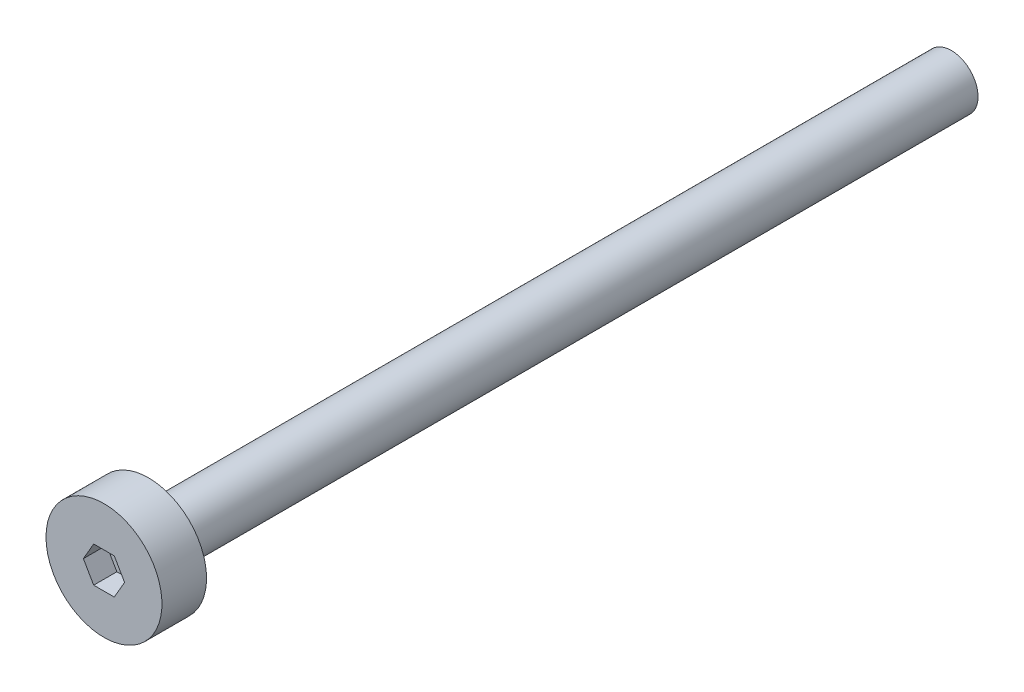
ISO-10303-21;
HEADER;
FILE_DESCRIPTION(('STEP AP214'),'2;1');
FILE_NAME('part.step','',(''),(''),'','','');
FILE_SCHEMA(('AUTOMOTIVE_DESIGN { 1 0 10303 214 1 1 1 1 }'));
ENDSEC;
DATA;
#1=APPLICATION_CONTEXT('core data for automotive mechanical design processes');
#2=APPLICATION_PROTOCOL_DEFINITION('international standard','automotive_design',2000,#1);
#3=PRODUCT_CONTEXT('',#1,'mechanical');
#4=PRODUCT('Part','Part','',(#3));
#5=PRODUCT_RELATED_PRODUCT_CATEGORY('part','',(#4));
#6=PRODUCT_DEFINITION_FORMATION('','',#4);
#7=PRODUCT_DEFINITION_CONTEXT('part definition',#1,'design');
#8=PRODUCT_DEFINITION('design','',#6,#7);
#9=PRODUCT_DEFINITION_SHAPE('','',#8);
#10=(LENGTH_UNIT() NAMED_UNIT(*) SI_UNIT(.MILLI.,.METRE.));
#11=(NAMED_UNIT(*) PLANE_ANGLE_UNIT() SI_UNIT($,.RADIAN.));
#12=(NAMED_UNIT(*) SI_UNIT($,.STERADIAN.) SOLID_ANGLE_UNIT());
#13=UNCERTAINTY_MEASURE_WITH_UNIT(LENGTH_MEASURE(1.E-05),#10,'distance_accuracy_value','');
#14=(GEOMETRIC_REPRESENTATION_CONTEXT(3) GLOBAL_UNCERTAINTY_ASSIGNED_CONTEXT((#13)) GLOBAL_UNIT_ASSIGNED_CONTEXT((#10,
#11,#12)) REPRESENTATION_CONTEXT('',''));
#15=CARTESIAN_POINT('',(0.,0.,0.));
#16=DIRECTION('',(0.,0.,1.));
#17=DIRECTION('',(1.,0.,0.));
#18=AXIS2_PLACEMENT_3D('',#15,#16,#17);
#19=CARTESIAN_POINT('',(0.,0.,1.2));
#20=DIRECTION('',(0.,0.,1.));
#21=DIRECTION('',(1.,0.,0.));
#22=AXIS2_PLACEMENT_3D('',#19,#20,#21);
#23=PLANE('',#22);
#24=DIRECTION('',(-0.50000000000019,0.866025403784329,0.));
#25=VECTOR('',#24,1.);
#26=CARTESIAN_POINT('',(1.154700538379,0.,1.2));
#27=LINE('',#26,#25);
#28=CARTESIAN_POINT('',(1.154700538379,0.,1.2));
#29=VERTEX_POINT('',#28);
#30=CARTESIAN_POINT('',(0.57735026919,1.,1.2));
#31=VERTEX_POINT('',#30);
#32=EDGE_CURVE('E10',#29,#31,#27,.T.);
#33=ORIENTED_EDGE('',*,*,#32,.T.);
#34=DIRECTION('',(-1.,0.,0.));
#35=VECTOR('',#34,1.);
#36=CARTESIAN_POINT('',(0.57735026919,1.,1.2));
#37=LINE('',#36,#35);
#38=CARTESIAN_POINT('',(-0.57735026919,1.,1.2));
#39=VERTEX_POINT('',#38);
#40=EDGE_CURVE('E146',#31,#39,#37,.T.);
#41=ORIENTED_EDGE('',*,*,#40,.T.);
#42=DIRECTION('',(-0.50000000000019,-0.866025403784329,0.));
#43=VECTOR('',#42,1.);
#44=CARTESIAN_POINT('',(-0.57735026919,1.,1.2));
#45=LINE('',#44,#43);
#46=CARTESIAN_POINT('',(-1.154700538379,0.,1.2));
#47=VERTEX_POINT('',#46);
#48=EDGE_CURVE('E147',#39,#47,#45,.T.);
#49=ORIENTED_EDGE('',*,*,#48,.T.);
#50=DIRECTION('',(0.50000000000019,-0.866025403784329,0.));
#51=VECTOR('',#50,1.);
#52=CARTESIAN_POINT('',(-1.154700538379,0.,1.2));
#53=LINE('',#52,#51);
#54=CARTESIAN_POINT('',(-0.57735026919,-1.,1.2));
#55=VERTEX_POINT('',#54);
#56=EDGE_CURVE('E168',#47,#55,#53,.T.);
#57=ORIENTED_EDGE('',*,*,#56,.T.);
#58=DIRECTION('',(1.,0.,0.));
#59=VECTOR('',#58,1.);
#60=CARTESIAN_POINT('',(-0.57735026919,-1.,1.2));
#61=LINE('',#60,#59);
#62=CARTESIAN_POINT('',(0.57735026919,-1.,1.2));
#63=VERTEX_POINT('',#62);
#64=EDGE_CURVE('E124',#55,#63,#61,.T.);
#65=ORIENTED_EDGE('',*,*,#64,.T.);
#66=DIRECTION('',(0.50000000000019,0.866025403784329,0.));
#67=VECTOR('',#66,1.);
#68=CARTESIAN_POINT('',(0.57735026919,-1.,1.2));
#69=LINE('',#68,#67);
#70=EDGE_CURVE('E128',#63,#29,#69,.T.);
#71=ORIENTED_EDGE('',*,*,#70,.T.);
#72=EDGE_LOOP('',(#33,#41,#49,#57,#65,#71));
#73=FACE_BOUND('',#72,.T.);
#74=ADVANCED_FACE('F15',(#73),#23,.T.);
#75=CARTESIAN_POINT('',(0.,0.,-45.));
#76=DIRECTION('',(0.,0.,-1.));
#77=DIRECTION('',(0.,-1.,0.));
#78=AXIS2_PLACEMENT_3D('',#75,#76,#77);
#79=PLANE('',#78);
#80=CARTESIAN_POINT('',(0.,0.,-45.));
#81=DIRECTION('',(0.,0.,-1.));
#82=DIRECTION('',(-1.,0.,0.));
#83=AXIS2_PLACEMENT_3D('',#80,#81,#82);
#84=CIRCLE('',#83,1.5);
#85=CARTESIAN_POINT('',(-1.5,0.,-45.));
#86=VERTEX_POINT('',#85);
#87=EDGE_CURVE('E138',#86,#86,#84,.T.);
#88=ORIENTED_EDGE('',*,*,#87,.T.);
#89=EDGE_LOOP('',(#88));
#90=FACE_BOUND('',#89,.T.);
#91=ADVANCED_FACE('F218',(#90),#79,.T.);
#92=CARTESIAN_POINT('',(1.154700538379,0.,1.2));
#93=DIRECTION('',(-0.866025403784329,-0.50000000000019,0.));
#94=DIRECTION('',(-0.50000000000019,0.866025403784329,0.));
#95=AXIS2_PLACEMENT_3D('',#92,#93,#94);
#96=PLANE('',#95);
#97=ORIENTED_EDGE('',*,*,#32,.F.);
#98=DIRECTION('',(0.,0.,1.));
#99=VECTOR('',#98,1.);
#100=CARTESIAN_POINT('',(1.154700538379,0.,1.2));
#101=LINE('',#100,#99);
#102=CARTESIAN_POINT('',(1.154700538379,0.,2.5));
#103=VERTEX_POINT('',#102);
#104=EDGE_CURVE('E19',#29,#103,#101,.T.);
#105=ORIENTED_EDGE('',*,*,#104,.T.);
#106=DIRECTION('',(-0.50000000000019,0.866025403784329,0.));
#107=VECTOR('',#106,1.);
#108=CARTESIAN_POINT('',(1.010362971082,0.25,2.5));
#109=LINE('',#108,#107);
#110=CARTESIAN_POINT('',(0.57735026919,1.,2.5));
#111=VERTEX_POINT('',#110);
#112=EDGE_CURVE('E142',#103,#111,#109,.T.);
#113=ORIENTED_EDGE('',*,*,#112,.T.);
#114=DIRECTION('',(0.,0.,1.));
#115=VECTOR('',#114,1.);
#116=CARTESIAN_POINT('',(0.57735026919,1.,1.2));
#117=LINE('',#116,#115);
#118=EDGE_CURVE('E26',#31,#111,#117,.T.);
#119=ORIENTED_EDGE('',*,*,#118,.F.);
#120=EDGE_LOOP('',(#97,#105,#113,#119));
#121=FACE_BOUND('',#120,.T.);
#122=ADVANCED_FACE('F126',(#121),#96,.T.);
#123=CARTESIAN_POINT('',(0.57735026919,1.,1.2));
#124=DIRECTION('',(0.,-1.,0.));
#125=DIRECTION('',(-1.,0.,0.));
#126=AXIS2_PLACEMENT_3D('',#123,#124,#125);
#127=PLANE('',#126);
#128=ORIENTED_EDGE('',*,*,#40,.F.);
#129=ORIENTED_EDGE('',*,*,#118,.T.);
#130=DIRECTION('',(-1.,0.,0.));
#131=VECTOR('',#130,1.);
#132=CARTESIAN_POINT('',(0.288675134595,1.,2.5));
#133=LINE('',#132,#131);
#134=CARTESIAN_POINT('',(-0.57735026919,1.,2.5));
#135=VERTEX_POINT('',#134);
#136=EDGE_CURVE('E151',#111,#135,#133,.T.);
#137=ORIENTED_EDGE('',*,*,#136,.T.);
#138=DIRECTION('',(0.,0.,1.));
#139=VECTOR('',#138,1.);
#140=CARTESIAN_POINT('',(-0.57735026919,1.,1.2));
#141=LINE('',#140,#139);
#142=EDGE_CURVE('E143',#39,#135,#141,.T.);
#143=ORIENTED_EDGE('',*,*,#142,.F.);
#144=EDGE_LOOP('',(#128,#129,#137,#143));
#145=FACE_BOUND('',#144,.T.);
#146=ADVANCED_FACE('F17',(#145),#127,.T.);
#147=CARTESIAN_POINT('',(-0.57735026919,1.,1.2));
#148=DIRECTION('',(0.866025403784329,-0.50000000000019,0.));
#149=DIRECTION('',(0.,0.,-1.));
#150=AXIS2_PLACEMENT_3D('',#147,#148,#149);
#151=PLANE('',#150);
#152=ORIENTED_EDGE('',*,*,#48,.F.);
#153=ORIENTED_EDGE('',*,*,#142,.T.);
#154=DIRECTION('',(-0.50000000000019,-0.866025403784329,0.));
#155=VECTOR('',#154,1.);
#156=CARTESIAN_POINT('',(-0.721687836487,0.75,2.5));
#157=LINE('',#156,#155);
#158=CARTESIAN_POINT('',(-1.154700538379,0.,2.5));
#159=VERTEX_POINT('',#158);
#160=EDGE_CURVE('E148',#135,#159,#157,.T.);
#161=ORIENTED_EDGE('',*,*,#160,.T.);
#162=DIRECTION('',(0.,0.,1.));
#163=VECTOR('',#162,1.);
#164=CARTESIAN_POINT('',(-1.154700538379,0.,1.2));
#165=LINE('',#164,#163);
#166=EDGE_CURVE('E66',#47,#159,#165,.T.);
#167=ORIENTED_EDGE('',*,*,#166,.F.);
#168=EDGE_LOOP('',(#152,#153,#161,#167));
#169=FACE_BOUND('',#168,.T.);
#170=ADVANCED_FACE('F236',(#169),#151,.T.);
#171=CARTESIAN_POINT('',(-1.154700538379,0.,1.2));
#172=DIRECTION('',(0.866025403784329,0.50000000000019,0.));
#173=DIRECTION('',(0.,0.,-1.));
#174=AXIS2_PLACEMENT_3D('',#171,#172,#173);
#175=PLANE('',#174);
#176=ORIENTED_EDGE('',*,*,#56,.F.);
#177=ORIENTED_EDGE('',*,*,#166,.T.);
#178=DIRECTION('',(0.50000000000019,-0.866025403784329,0.));
#179=VECTOR('',#178,1.);
#180=CARTESIAN_POINT('',(-1.010362971082,-0.25,2.5));
#181=LINE('',#180,#179);
#182=CARTESIAN_POINT('',(-0.57735026919,-1.,2.5));
#183=VERTEX_POINT('',#182);
#184=EDGE_CURVE('E152',#159,#183,#181,.T.);
#185=ORIENTED_EDGE('',*,*,#184,.T.);
#186=DIRECTION('',(0.,0.,1.));
#187=VECTOR('',#186,1.);
#188=CARTESIAN_POINT('',(-0.57735026919,-1.,1.2));
#189=LINE('',#188,#187);
#190=EDGE_CURVE('E174',#55,#183,#189,.T.);
#191=ORIENTED_EDGE('',*,*,#190,.F.);
#192=EDGE_LOOP('',(#176,#177,#185,#191));
#193=FACE_BOUND('',#192,.T.);
#194=ADVANCED_FACE('F229',(#193),#175,.T.);
#195=CARTESIAN_POINT('',(-0.57735026919,-1.,1.2));
#196=DIRECTION('',(0.,1.,0.));
#197=DIRECTION('',(1.,0.,0.));
#198=AXIS2_PLACEMENT_3D('',#195,#196,#197);
#199=PLANE('',#198);
#200=ORIENTED_EDGE('',*,*,#64,.F.);
#201=ORIENTED_EDGE('',*,*,#190,.T.);
#202=DIRECTION('',(1.,0.,0.));
#203=VECTOR('',#202,1.);
#204=CARTESIAN_POINT('',(-0.288675134595,-1.,2.5));
#205=LINE('',#204,#203);
#206=CARTESIAN_POINT('',(0.57735026919,-1.,2.5));
#207=VERTEX_POINT('',#206);
#208=EDGE_CURVE('E161',#183,#207,#205,.T.);
#209=ORIENTED_EDGE('',*,*,#208,.T.);
#210=DIRECTION('',(0.,0.,1.));
#211=VECTOR('',#210,1.);
#212=CARTESIAN_POINT('',(0.57735026919,-1.,1.2));
#213=LINE('',#212,#211);
#214=EDGE_CURVE('E82',#63,#207,#213,.T.);
#215=ORIENTED_EDGE('',*,*,#214,.F.);
#216=EDGE_LOOP('',(#200,#201,#209,#215));
#217=FACE_BOUND('',#216,.T.);
#218=ADVANCED_FACE('F227',(#217),#199,.T.);
#219=CARTESIAN_POINT('',(0.57735026919,-1.,1.2));
#220=DIRECTION('',(-0.866025403784329,0.50000000000019,0.));
#221=DIRECTION('',(0.,0.,1.));
#222=AXIS2_PLACEMENT_3D('',#219,#220,#221);
#223=PLANE('',#222);
#224=ORIENTED_EDGE('',*,*,#70,.F.);
#225=ORIENTED_EDGE('',*,*,#214,.T.);
#226=DIRECTION('',(0.50000000000019,0.866025403784329,0.));
#227=VECTOR('',#226,1.);
#228=CARTESIAN_POINT('',(0.721687836487,-0.75,2.5));
#229=LINE('',#228,#227);
#230=EDGE_CURVE('E129',#207,#103,#229,.T.);
#231=ORIENTED_EDGE('',*,*,#230,.T.);
#232=ORIENTED_EDGE('',*,*,#104,.F.);
#233=EDGE_LOOP('',(#224,#225,#231,#232));
#234=FACE_BOUND('',#233,.T.);
#235=ADVANCED_FACE('F127',(#234),#223,.T.);
#236=CARTESIAN_POINT('',(0.,0.,0.));
#237=DIRECTION('',(0.,0.,-1.));
#238=DIRECTION('',(-1.,0.,0.));
#239=AXIS2_PLACEMENT_3D('',#236,#237,#238);
#240=CYLINDRICAL_SURFACE('',#239,1.5);
#241=ORIENTED_EDGE('',*,*,#87,.F.);
#242=DIRECTION('',(0.,0.,-1.));
#243=VECTOR('',#242,1.);
#244=CARTESIAN_POINT('',(-1.5,0.,0.));
#245=LINE('',#244,#243);
#246=CARTESIAN_POINT('',(-1.5,0.,0.));
#247=VERTEX_POINT('',#246);
#248=EDGE_CURVE('E117',#247,#86,#245,.T.);
#249=ORIENTED_EDGE('',*,*,#248,.F.);
#250=CARTESIAN_POINT('',(0.,0.,0.));
#251=DIRECTION('',(0.,0.,-1.));
#252=DIRECTION('',(-1.,0.,0.));
#253=AXIS2_PLACEMENT_3D('',#250,#251,#252);
#254=CIRCLE('',#253,1.5);
#255=EDGE_CURVE('E169',#247,#247,#254,.T.);
#256=ORIENTED_EDGE('',*,*,#255,.T.);
#257=ORIENTED_EDGE('',*,*,#248,.T.);
#258=EDGE_LOOP('',(#241,#249,#256,#257));
#259=FACE_BOUND('',#258,.T.);
#260=ADVANCED_FACE('F204',(#259),#240,.T.);
#261=CARTESIAN_POINT('',(0.,0.,2.5));
#262=DIRECTION('',(0.,0.,-1.));
#263=DIRECTION('',(0.,-1.,0.));
#264=AXIS2_PLACEMENT_3D('',#261,#262,#263);
#265=PLANE('',#264);
#266=ORIENTED_EDGE('',*,*,#208,.F.);
#267=ORIENTED_EDGE('',*,*,#184,.F.);
#268=ORIENTED_EDGE('',*,*,#160,.F.);
#269=ORIENTED_EDGE('',*,*,#136,.F.);
#270=ORIENTED_EDGE('',*,*,#112,.F.);
#271=ORIENTED_EDGE('',*,*,#230,.F.);
#272=EDGE_LOOP('',(#266,#267,#268,#269,#270,#271));
#273=FACE_BOUND('',#272,.T.);
#274=CARTESIAN_POINT('',(0.,0.,2.5));
#275=DIRECTION('',(0.,0.,-1.));
#276=DIRECTION('',(-1.,0.,0.));
#277=AXIS2_PLACEMENT_3D('',#274,#275,#276);
#278=CIRCLE('',#277,3.25);
#279=CARTESIAN_POINT('',(-3.25,0.,2.5));
#280=VERTEX_POINT('',#279);
#281=EDGE_CURVE('E172',#280,#280,#278,.T.);
#282=ORIENTED_EDGE('',*,*,#281,.F.);
#283=EDGE_LOOP('',(#282));
#284=FACE_BOUND('',#283,.T.);
#285=ADVANCED_FACE('F202',(#273,#284),#265,.F.);
#286=CARTESIAN_POINT('',(0.,0.,0.));
#287=DIRECTION('',(0.,0.,-1.));
#288=DIRECTION('',(0.,-1.,0.));
#289=AXIS2_PLACEMENT_3D('',#286,#287,#288);
#290=PLANE('',#289);
#291=ORIENTED_EDGE('',*,*,#255,.F.);
#292=EDGE_LOOP('',(#291));
#293=FACE_BOUND('',#292,.T.);
#294=CARTESIAN_POINT('',(0.,0.,0.));
#295=DIRECTION('',(0.,0.,-1.));
#296=DIRECTION('',(-1.,0.,0.));
#297=AXIS2_PLACEMENT_3D('',#294,#295,#296);
#298=CIRCLE('',#297,3.25);
#299=CARTESIAN_POINT('',(-3.25,0.,0.));
#300=VERTEX_POINT('',#299);
#301=EDGE_CURVE('E189',#300,#300,#298,.T.);
#302=ORIENTED_EDGE('',*,*,#301,.T.);
#303=EDGE_LOOP('',(#302));
#304=FACE_BOUND('',#303,.T.);
#305=ADVANCED_FACE('F196',(#293,#304),#290,.T.);
#306=CARTESIAN_POINT('',(0.,0.,2.5));
#307=DIRECTION('',(0.,0.,-1.));
#308=DIRECTION('',(-1.,0.,0.));
#309=AXIS2_PLACEMENT_3D('',#306,#307,#308);
#310=CYLINDRICAL_SURFACE('',#309,3.25);
#311=ORIENTED_EDGE('',*,*,#301,.F.);
#312=DIRECTION('',(0.,0.,-1.));
#313=VECTOR('',#312,1.);
#314=CARTESIAN_POINT('',(-3.25,0.,2.5));
#315=LINE('',#314,#313);
#316=EDGE_CURVE('E187',#280,#300,#315,.T.);
#317=ORIENTED_EDGE('',*,*,#316,.F.);
#318=ORIENTED_EDGE('',*,*,#281,.T.);
#319=ORIENTED_EDGE('',*,*,#316,.T.);
#320=EDGE_LOOP('',(#311,#317,#318,#319));
#321=FACE_BOUND('',#320,.T.);
#322=ADVANCED_FACE('F199',(#321),#310,.T.);
#323=CLOSED_SHELL('',(#74,#91,#122,#146,#170,#194,#218,#235,#260,#285,#305,#322));
#324=MANIFOLD_SOLID_BREP('B1',#323);
#325=ADVANCED_BREP_SHAPE_REPRESENTATION('',(#18,#324),#14);
#326=SHAPE_DEFINITION_REPRESENTATION(#9,#325);
ENDSEC;
END-ISO-10303-21;
